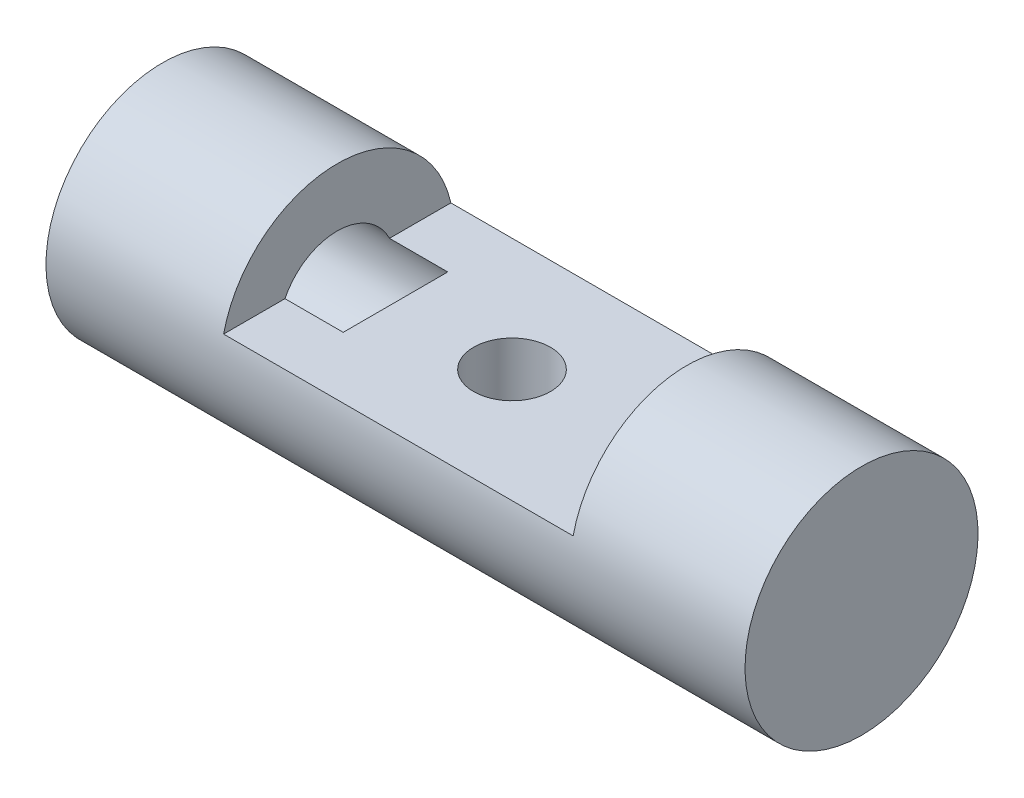
ISO-10303-21;
HEADER;
FILE_DESCRIPTION(('STEP AP214'),'2;1');
FILE_NAME('part.step','',(''),(''),'','','');
FILE_SCHEMA(('AUTOMOTIVE_DESIGN { 1 0 10303 214 1 1 1 1 }'));
ENDSEC;
DATA;
#1=APPLICATION_CONTEXT('core data for automotive mechanical design processes');
#2=APPLICATION_PROTOCOL_DEFINITION('international standard','automotive_design',2000,#1);
#3=PRODUCT_CONTEXT('',#1,'mechanical');
#4=PRODUCT('Part','Part','',(#3));
#5=PRODUCT_RELATED_PRODUCT_CATEGORY('part','',(#4));
#6=PRODUCT_DEFINITION_FORMATION('','',#4);
#7=PRODUCT_DEFINITION_CONTEXT('part definition',#1,'design');
#8=PRODUCT_DEFINITION('design','',#6,#7);
#9=PRODUCT_DEFINITION_SHAPE('','',#8);
#10=(LENGTH_UNIT() NAMED_UNIT(*) SI_UNIT(.MILLI.,.METRE.));
#11=(NAMED_UNIT(*) PLANE_ANGLE_UNIT() SI_UNIT($,.RADIAN.));
#12=(NAMED_UNIT(*) SI_UNIT($,.STERADIAN.) SOLID_ANGLE_UNIT());
#13=UNCERTAINTY_MEASURE_WITH_UNIT(LENGTH_MEASURE(1.E-05),#10,'distance_accuracy_value','');
#14=(GEOMETRIC_REPRESENTATION_CONTEXT(3) GLOBAL_UNCERTAINTY_ASSIGNED_CONTEXT((#13)) GLOBAL_UNIT_ASSIGNED_CONTEXT((#10,
#11,#12)) REPRESENTATION_CONTEXT('',''));
#15=CARTESIAN_POINT('',(0.,0.,0.));
#16=DIRECTION('',(0.,0.,1.));
#17=DIRECTION('',(1.,0.,0.));
#18=AXIS2_PLACEMENT_3D('',#15,#16,#17);
#19=CARTESIAN_POINT('',(-15.,0.,0.));
#20=DIRECTION('',(-1.,0.,0.));
#21=DIRECTION('',(0.,-1.,0.));
#22=AXIS2_PLACEMENT_3D('',#19,#20,#21);
#23=CYLINDRICAL_SURFACE('',#22,5.);
#24=CARTESIAN_POINT('',(1.65,-5.,0.));
#25=CARTESIAN_POINT('',(1.65000024251439,-5.00000012564882,0.090080332398987));
#26=CARTESIAN_POINT('',(1.64259916251505,-4.99754312617873,0.180159574077354));
#27=CARTESIAN_POINT('',(1.61327885047236,-4.98798348171152,0.357667875169256));
#28=CARTESIAN_POINT('',(1.59135782416471,-4.98088026257135,0.445096605656319));
#29=CARTESIAN_POINT('',(1.53382868761171,-4.96280068143201,0.614719075952393));
#30=CARTESIAN_POINT('',(1.49824318298597,-4.95183071876683,0.696921201899967));
#31=CARTESIAN_POINT('',(1.41449642730815,-4.92713947248838,0.854190645874483));
#32=CARTESIAN_POINT('',(1.36633277369657,-4.91341766335966,0.92925659707605));
#33=CARTESIAN_POINT('',(1.25707517692859,-4.88414667976015,1.07267700256014));
#34=CARTESIAN_POINT('',(1.19562998172584,-4.86855436886587,1.140755021368));
#35=CARTESIAN_POINT('',(1.06230048608017,-4.83753907804007,1.26585047260417));
#36=CARTESIAN_POINT('',(0.990413953307284,-4.8221161350793,1.32286553369749));
#37=CARTESIAN_POINT('',(0.835769387620546,-4.79271313173334,1.42578155512387));
#38=CARTESIAN_POINT('',(0.752762762414837,-4.77878574898835,1.47132547146369));
#39=CARTESIAN_POINT('',(0.579734369165923,-4.75460549483771,1.54768950007051));
#40=CARTESIAN_POINT('',(0.489714702647667,-4.74435152777496,1.57851400356115));
#41=CARTESIAN_POINT('',(0.308355170918736,-4.729132826351,1.62353134991423));
#42=CARTESIAN_POINT('',(0.217157836674354,-4.72400412235766,1.6382413417332));
#43=CARTESIAN_POINT('',(0.0334563873059896,-4.7191313464795,1.65222861163856));
#44=CARTESIAN_POINT('',(-0.0590473250677401,-4.71938564975367,1.65151054662634));
#45=CARTESIAN_POINT('',(-0.238347202392313,-4.72510629107569,1.63506410098719));
#46=CARTESIAN_POINT('',(-0.325213735238814,-4.73033928879681,1.62000769651632));
#47=CARTESIAN_POINT('',(-0.495110906166727,-4.74504632523487,1.57640708934977));
#48=CARTESIAN_POINT('',(-0.578141092265254,-4.75452086227438,1.54786130181506));
#49=CARTESIAN_POINT('',(-0.739547439994633,-4.77681173940999,1.47764674240872));
#50=CARTESIAN_POINT('',(-0.817828850225322,-4.78967871947683,1.43577693123636));
#51=CARTESIAN_POINT('',(-0.966468362301519,-4.81728315916032,1.34024242388315));
#52=CARTESIAN_POINT('',(-1.03682420369405,-4.8320211498719,1.28657437554158));
#53=CARTESIAN_POINT('',(-1.17139522741021,-4.86262798242566,1.16572801734404));
#54=CARTESIAN_POINT('',(-1.23511287864314,-4.87851612594016,1.09799945388895));
#55=CARTESIAN_POINT('',(-1.3504141782392,-4.9089733458653,0.952622363558089));
#56=CARTESIAN_POINT('',(-1.40199670875498,-4.92354230068063,0.874972923819718));
#57=CARTESIAN_POINT('',(-1.49195351683702,-4.94990429259939,0.710918878360193));
#58=CARTESIAN_POINT('',(-1.53019689721305,-4.96166947936115,0.624437715003008));
#59=CARTESIAN_POINT('',(-1.5914397196063,-4.98089634514734,0.445788820584338));
#60=CARTESIAN_POINT('',(-1.61444434706412,-4.98835948795834,0.353623035566634));
#61=CARTESIAN_POINT('',(-1.64368078538325,-4.99790001929539,0.170434936942808));
#62=CARTESIAN_POINT('',(-1.65058509363946,-5.00019320840939,0.0795310449403298));
#63=CARTESIAN_POINT('',(-1.64933736730874,-4.99978120399321,-0.102152997074191));
#64=CARTESIAN_POINT('',(-1.64118781713324,-4.99707683523427,-0.19293316503069));
#65=CARTESIAN_POINT('',(-1.61059717381709,-4.98711592890816,-0.369117276094977));
#66=CARTESIAN_POINT('',(-1.58856678998547,-4.97999029806495,-0.454600657078436));
#67=CARTESIAN_POINT('',(-1.53135130848825,-4.9620361021664,-0.620625393385989));
#68=CARTESIAN_POINT('',(-1.4961645401181,-4.95120706683759,-0.701166119538831));
#69=CARTESIAN_POINT('',(-1.41261898044763,-4.92659738190256,-0.857353583850656));
#70=CARTESIAN_POINT('',(-1.36394138523551,-4.91274728599483,-0.932818538636812));
#71=CARTESIAN_POINT('',(-1.25517176520409,-4.88366806339029,-1.07472879779133));
#72=CARTESIAN_POINT('',(-1.19507631632604,-4.86843852373583,-1.14117138619964));
#73=CARTESIAN_POINT('',(-1.06201382730805,-4.8374590984749,-1.26622547851876));
#74=CARTESIAN_POINT('',(-0.988593133076301,-4.82171620160002,-1.32435715949936));
#75=CARTESIAN_POINT('',(-0.832700145106316,-4.79218567046632,-1.42753142742357));
#76=CARTESIAN_POINT('',(-0.750227816840758,-4.77839804366633,-1.47257396443646));
#77=CARTESIAN_POINT('',(-0.578574516041665,-4.75447746870333,-1.54806908435207));
#78=CARTESIAN_POINT('',(-0.489410014022784,-4.74433588191365,-1.57855621066785));
#79=CARTESIAN_POINT('',(-0.306802097920406,-4.72899266246799,-1.62395003915296));
#80=CARTESIAN_POINT('',(-0.213360579787974,-4.72378886275909,-1.63886357641239));
#81=CARTESIAN_POINT('',(-0.0299145750870886,-4.71915352744857,-1.65216049477083));
#82=CARTESIAN_POINT('',(0.0600259363781703,-4.71944442417866,-1.65133872365081));
#83=CARTESIAN_POINT('',(0.238416599590154,-4.72508139490562,-1.63513842564514));
#84=CARTESIAN_POINT('',(0.326866836415119,-4.7304271793221,-1.61976073262755));
#85=CARTESIAN_POINT('',(0.498164137184589,-4.74536693764462,-1.57544291875231));
#86=CARTESIAN_POINT('',(0.581083972157472,-4.75488165289364,-1.5467552709297));
#87=CARTESIAN_POINT('',(0.740997492662577,-4.77705935615133,-1.47683540940045));
#88=CARTESIAN_POINT('',(0.817989874951903,-4.78972303393434,-1.43560044678476));
#89=CARTESIAN_POINT('',(0.967443454366385,-4.81744939348764,-1.33969084183065));
#90=CARTESIAN_POINT('',(1.03956841106977,-4.83259170443489,-1.28451538865981));
#91=CARTESIAN_POINT('',(1.17379258067502,-4.86323043063063,-1.16314331347536));
#92=CARTESIAN_POINT('',(1.23588897512673,-4.87872694403301,-1.09694360376003));
#93=CARTESIAN_POINT('',(1.35066333180925,-4.90903317548773,-0.952387676734103));
#94=CARTESIAN_POINT('',(1.40289502168525,-4.92379458911326,-0.873665758138171));
#95=CARTESIAN_POINT('',(1.49332485789776,-4.95031750248797,-0.70807708205127));
#96=CARTESIAN_POINT('',(1.53152691711137,-4.96207983840249,-0.621212604024478));
#97=CARTESIAN_POINT('',(1.59101301503052,-4.98076953032462,-0.44638654187221));
#98=CARTESIAN_POINT('',(1.61306352248398,-4.98791371763214,-0.35870915508395));
#99=CARTESIAN_POINT('',(1.6425549720432,-4.99752827480817,-0.180687007883427));
#100=CARTESIAN_POINT('',(1.64999975677857,-4.99999987398486,-0.0903429553968474));
#101=CARTESIAN_POINT('',(1.65,-5.,0.));
#102=B_SPLINE_CURVE_WITH_KNOTS('',3,(#24,#25,#26,#27,#28,#29,#30,#31,#32,#33,#34,#35,#36,#37,
#38,#39,#40,#41,#42,#43,#44,#45,#46,#47,#48,#49,#50,#51,#52,#53,#54,#55,#56,#57,#58,#59,#60,#61,
#62,#63,#64,#65,#66,#67,#68,#69,#70,#71,#72,#73,#74,#75,#76,#77,#78,#79,#80,#81,#82,#83,#84,#85,
#86,#87,#88,#89,#90,#91,#92,#93,#94,#95,#96,#97,#98,#99,#100,#101),.UNSPECIFIED.,.T.,.F.,(4,2,2,
2,2,2,2,2,2,2,2,2,2,2,2,2,2,2,2,2,2,2,2,2,2,2,2,2,2,2,2,2,2,2,2,2,2,2,4),(0.,0.2699086041325,
0.539850567737247,0.809347867689093,1.07889668217443,1.35671215765951,1.63458711701568,
1.92026489148117,2.20585738673402,2.48198869358466,2.75803665240173,3.02175295330503,
3.28550024538372,3.55343249441286,3.82144096800204,4.10314526837294,4.38487550826386,
4.66929734218008,4.95362234329174,5.22584041060146,5.49801355645392,5.76248915124947,
6.02699834271654,6.29838751507404,6.56985820217367,6.85340472718153,7.13695233381085,
7.41982362841785,7.7025707214407,7.97107468624608,8.23956327014094,8.50315503612409,
8.7668045923309,9.04176838412561,9.31680931840236,9.60227659952696,9.88766420298744,
10.1584309528124,10.4291264568694),.UNSPECIFIED.);
#103=CARTESIAN_POINT('',(1.65,-5.,0.));
#104=VERTEX_POINT('',#103);
#105=EDGE_CURVE('E11',#104,#104,#102,.T.);
#106=ORIENTED_EDGE('',*,*,#105,.F.);
#107=EDGE_LOOP('',(#106));
#108=FACE_BOUND('',#107,.T.);
#109=CARTESIAN_POINT('',(-15.,0.,0.));
#110=DIRECTION('',(-1.,0.,0.));
#111=DIRECTION('',(0.,-1.,0.));
#112=AXIS2_PLACEMENT_3D('',#109,#110,#111);
#113=CIRCLE('',#112,5.);
#114=CARTESIAN_POINT('',(-15.,-5.,0.));
#115=VERTEX_POINT('',#114);
#116=EDGE_CURVE('E28',#115,#115,#113,.T.);
#117=ORIENTED_EDGE('',*,*,#116,.F.);
#118=EDGE_LOOP('',(#117));
#119=FACE_BOUND('',#118,.T.);
#120=CARTESIAN_POINT('',(15.,0.,0.));
#121=DIRECTION('',(-1.,0.,0.));
#122=DIRECTION('',(0.,-1.,0.));
#123=AXIS2_PLACEMENT_3D('',#120,#121,#122);
#124=CIRCLE('',#123,5.);
#125=CARTESIAN_POINT('',(15.,-4.99999999999999,0.));
#126=VERTEX_POINT('',#125);
#127=EDGE_CURVE('E100',#126,#126,#124,.T.);
#128=ORIENTED_EDGE('',*,*,#127,.T.);
#129=EDGE_LOOP('',(#128));
#130=FACE_BOUND('',#129,.T.);
#131=DIRECTION('',(-1.,0.,0.));
#132=VECTOR('',#131,1.);
#133=CARTESIAN_POINT('',(-15.,1.10378117628698,4.87664506755152));
#134=LINE('',#133,#132);
#135=CARTESIAN_POINT('',(-7.5,1.10378117628698,4.87664506755152));
#136=VERTEX_POINT('',#135);
#137=CARTESIAN_POINT('',(7.5,1.10378117628698,4.87664506755152));
#138=VERTEX_POINT('',#137);
#139=EDGE_CURVE('E35',#136,#138,#134,.F.);
#140=ORIENTED_EDGE('',*,*,#139,.F.);
#141=CARTESIAN_POINT('',(-7.5,0.,0.));
#142=DIRECTION('',(1.,0.,0.));
#143=DIRECTION('',(0.,1.,0.));
#144=AXIS2_PLACEMENT_3D('',#141,#142,#143);
#145=CIRCLE('',#144,5.);
#146=CARTESIAN_POINT('',(-7.5,1.10378117628698,-4.87664506755152));
#147=VERTEX_POINT('',#146);
#148=EDGE_CURVE('E90',#147,#136,#145,.T.);
#149=ORIENTED_EDGE('',*,*,#148,.F.);
#150=DIRECTION('',(-1.,0.,0.));
#151=VECTOR('',#150,1.);
#152=CARTESIAN_POINT('',(-15.,1.10378117628698,-4.87664506755152));
#153=LINE('',#152,#151);
#154=CARTESIAN_POINT('',(7.5,1.10378117628698,-4.87664506755152));
#155=VERTEX_POINT('',#154);
#156=EDGE_CURVE('E76',#147,#155,#153,.F.);
#157=ORIENTED_EDGE('',*,*,#156,.T.);
#158=CARTESIAN_POINT('',(7.5,0.,0.));
#159=DIRECTION('',(-1.,0.,0.));
#160=DIRECTION('',(0.,-1.,0.));
#161=AXIS2_PLACEMENT_3D('',#158,#159,#160);
#162=CIRCLE('',#161,5.);
#163=EDGE_CURVE('E92',#138,#155,#162,.T.);
#164=ORIENTED_EDGE('',*,*,#163,.F.);
#165=EDGE_LOOP('',(#140,#149,#157,#164));
#166=FACE_BOUND('',#165,.T.);
#167=ADVANCED_FACE('F17',(#108,#119,#130,#166),#23,.T.);
#168=CARTESIAN_POINT('',(-5.,0.,0.));
#169=DIRECTION('',(-1.,0.,0.));
#170=DIRECTION('',(0.,-1.,0.));
#171=AXIS2_PLACEMENT_3D('',#168,#169,#170);
#172=CYLINDRICAL_SURFACE('',#171,2.5);
#173=CARTESIAN_POINT('',(-15.,0.,0.));
#174=DIRECTION('',(-1.,0.,0.));
#175=DIRECTION('',(0.,-1.,0.));
#176=AXIS2_PLACEMENT_3D('',#173,#174,#175);
#177=CIRCLE('',#176,2.5);
#178=CARTESIAN_POINT('',(-15.,-2.5,0.));
#179=VERTEX_POINT('',#178);
#180=EDGE_CURVE('E98',#179,#179,#177,.T.);
#181=ORIENTED_EDGE('',*,*,#180,.T.);
#182=EDGE_LOOP('',(#181));
#183=FACE_BOUND('',#182,.T.);
#184=DIRECTION('',(-1.,0.,0.));
#185=VECTOR('',#184,1.);
#186=CARTESIAN_POINT('',(-5.,1.10378117628698,-2.24313778330144));
#187=LINE('',#186,#185);
#188=CARTESIAN_POINT('',(-7.5,1.10378117628698,-2.24313778330144));
#189=VERTEX_POINT('',#188);
#190=CARTESIAN_POINT('',(-5.,1.10378117628698,-2.24313778330144));
#191=VERTEX_POINT('',#190);
#192=EDGE_CURVE('E42',#189,#191,#187,.F.);
#193=ORIENTED_EDGE('',*,*,#192,.F.);
#194=CARTESIAN_POINT('',(-7.5,0.,0.));
#195=DIRECTION('',(1.,0.,0.));
#196=DIRECTION('',(0.,1.,0.));
#197=AXIS2_PLACEMENT_3D('',#194,#195,#196);
#198=CIRCLE('',#197,2.5);
#199=CARTESIAN_POINT('',(-7.5,1.10378117628698,2.24313778330144));
#200=VERTEX_POINT('',#199);
#201=EDGE_CURVE('E62',#189,#200,#198,.T.);
#202=ORIENTED_EDGE('',*,*,#201,.T.);
#203=DIRECTION('',(-1.,0.,0.));
#204=VECTOR('',#203,1.);
#205=CARTESIAN_POINT('',(-5.,1.10378117628698,2.24313778330144));
#206=LINE('',#205,#204);
#207=CARTESIAN_POINT('',(-5.,1.10378117628698,2.24313778330144));
#208=VERTEX_POINT('',#207);
#209=EDGE_CURVE('E71',#200,#208,#206,.F.);
#210=ORIENTED_EDGE('',*,*,#209,.T.);
#211=CARTESIAN_POINT('',(-5.,0.,0.));
#212=DIRECTION('',(-1.,0.,0.));
#213=DIRECTION('',(0.,-1.,0.));
#214=AXIS2_PLACEMENT_3D('',#211,#212,#213);
#215=CIRCLE('',#214,2.5);
#216=EDGE_CURVE('E81',#191,#208,#215,.T.);
#217=ORIENTED_EDGE('',*,*,#216,.F.);
#218=EDGE_LOOP('',(#193,#202,#210,#217));
#219=FACE_BOUND('',#218,.T.);
#220=ADVANCED_FACE('F79',(#183,#219),#172,.F.);
#221=CARTESIAN_POINT('',(-5.,0.,0.));
#222=DIRECTION('',(-1.,0.,0.));
#223=DIRECTION('',(0.,-1.,0.));
#224=AXIS2_PLACEMENT_3D('',#221,#222,#223);
#225=PLANE('',#224);
#226=ORIENTED_EDGE('',*,*,#216,.T.);
#227=DIRECTION('',(0.,0.,1.));
#228=VECTOR('',#227,1.);
#229=CARTESIAN_POINT('',(-5.,1.10378117628698,5.001));
#230=LINE('',#229,#228);
#231=EDGE_CURVE('E72',#191,#208,#230,.T.);
#232=ORIENTED_EDGE('',*,*,#231,.F.);
#233=EDGE_LOOP('',(#226,#232));
#234=FACE_BOUND('',#233,.T.);
#235=ADVANCED_FACE('F131',(#234),#225,.T.);
#236=CARTESIAN_POINT('',(-15.,-5.,0.));
#237=DIRECTION('',(1.,0.,0.));
#238=DIRECTION('',(0.,1.,0.));
#239=AXIS2_PLACEMENT_3D('',#236,#237,#238);
#240=PLANE('',#239);
#241=ORIENTED_EDGE('',*,*,#180,.F.);
#242=EDGE_LOOP('',(#241));
#243=FACE_BOUND('',#242,.T.);
#244=ORIENTED_EDGE('',*,*,#116,.T.);
#245=EDGE_LOOP('',(#244));
#246=FACE_BOUND('',#245,.T.);
#247=ADVANCED_FACE('F107',(#243,#246),#240,.F.);
#248=CARTESIAN_POINT('',(15.,0.,0.));
#249=DIRECTION('',(-1.,0.,0.));
#250=DIRECTION('',(0.,-1.,0.));
#251=AXIS2_PLACEMENT_3D('',#248,#249,#250);
#252=PLANE('',#251);
#253=ORIENTED_EDGE('',*,*,#127,.F.);
#254=EDGE_LOOP('',(#253));
#255=FACE_BOUND('',#254,.T.);
#256=ADVANCED_FACE('F138',(#255),#252,.F.);
#257=CARTESIAN_POINT('',(-7.5,8.89621882371303,5.001));
#258=DIRECTION('',(1.,0.,0.));
#259=DIRECTION('',(0.,1.,0.));
#260=AXIS2_PLACEMENT_3D('',#257,#258,#259);
#261=PLANE('',#260);
#262=ORIENTED_EDGE('',*,*,#148,.T.);
#263=DIRECTION('',(0.,0.,-1.));
#264=VECTOR('',#263,1.);
#265=CARTESIAN_POINT('',(-7.5,1.10378117628698,5.001));
#266=LINE('',#265,#264);
#267=EDGE_CURVE('E67',#136,#200,#266,.T.);
#268=ORIENTED_EDGE('',*,*,#267,.T.);
#269=ORIENTED_EDGE('',*,*,#201,.F.);
#270=DIRECTION('',(0.,0.,1.));
#271=VECTOR('',#270,1.);
#272=CARTESIAN_POINT('',(-7.5,1.10378117628698,-5.001));
#273=LINE('',#272,#271);
#274=EDGE_CURVE('E65',#147,#189,#273,.T.);
#275=ORIENTED_EDGE('',*,*,#274,.F.);
#276=EDGE_LOOP('',(#262,#268,#269,#275));
#277=FACE_BOUND('',#276,.T.);
#278=ADVANCED_FACE('F64',(#277),#261,.T.);
#279=CARTESIAN_POINT('',(-7.5,1.10378117628698,5.001));
#280=DIRECTION('',(0.,1.,0.));
#281=DIRECTION('',(0.,0.,1.));
#282=AXIS2_PLACEMENT_3D('',#279,#280,#281);
#283=PLANE('',#282);
#284=CARTESIAN_POINT('',(0.,1.10378117628698,0.));
#285=DIRECTION('',(0.,1.,0.));
#286=DIRECTION('',(0.,0.,1.));
#287=AXIS2_PLACEMENT_3D('',#284,#285,#286);
#288=CIRCLE('',#287,1.65);
#289=CARTESIAN_POINT('',(0.,1.10378117628698,1.65));
#290=VERTEX_POINT('',#289);
#291=EDGE_CURVE('E82',#290,#290,#288,.T.);
#292=ORIENTED_EDGE('',*,*,#291,.F.);
#293=EDGE_LOOP('',(#292));
#294=FACE_BOUND('',#293,.T.);
#295=ORIENTED_EDGE('',*,*,#139,.T.);
#296=DIRECTION('',(0.,0.,-1.));
#297=VECTOR('',#296,1.);
#298=CARTESIAN_POINT('',(7.5,1.10378117628698,5.001));
#299=LINE('',#298,#297);
#300=EDGE_CURVE('E95',#138,#155,#299,.T.);
#301=ORIENTED_EDGE('',*,*,#300,.T.);
#302=ORIENTED_EDGE('',*,*,#156,.F.);
#303=ORIENTED_EDGE('',*,*,#274,.T.);
#304=ORIENTED_EDGE('',*,*,#192,.T.);
#305=ORIENTED_EDGE('',*,*,#231,.T.);
#306=ORIENTED_EDGE('',*,*,#209,.F.);
#307=ORIENTED_EDGE('',*,*,#267,.F.);
#308=EDGE_LOOP('',(#295,#301,#302,#303,#304,#305,#306,#307));
#309=FACE_BOUND('',#308,.T.);
#310=ADVANCED_FACE('F74',(#294,#309),#283,.T.);
#311=CARTESIAN_POINT('',(7.5,8.89621882371303,5.001));
#312=DIRECTION('',(-1.,0.,0.));
#313=DIRECTION('',(0.,-1.,0.));
#314=AXIS2_PLACEMENT_3D('',#311,#312,#313);
#315=PLANE('',#314);
#316=ORIENTED_EDGE('',*,*,#163,.T.);
#317=ORIENTED_EDGE('',*,*,#300,.F.);
#318=EDGE_LOOP('',(#316,#317));
#319=FACE_BOUND('',#318,.T.);
#320=ADVANCED_FACE('F116',(#319),#315,.T.);
#321=CARTESIAN_POINT('',(0.,1.10378117628698,0.));
#322=DIRECTION('',(0.,1.,0.));
#323=DIRECTION('',(0.,0.,1.));
#324=AXIS2_PLACEMENT_3D('',#321,#322,#323);
#325=CYLINDRICAL_SURFACE('',#324,1.65);
#326=ORIENTED_EDGE('',*,*,#105,.T.);
#327=EDGE_LOOP('',(#326));
#328=FACE_BOUND('',#327,.T.);
#329=ORIENTED_EDGE('',*,*,#291,.T.);
#330=EDGE_LOOP('',(#329));
#331=FACE_BOUND('',#330,.T.);
#332=ADVANCED_FACE('F118',(#328,#331),#325,.F.);
#333=CLOSED_SHELL('',(#167,#220,#235,#247,#256,#278,#310,#320,#332));
#334=MANIFOLD_SOLID_BREP('B1',#333);
#335=ADVANCED_BREP_SHAPE_REPRESENTATION('',(#18,#334),#14);
#336=SHAPE_DEFINITION_REPRESENTATION(#9,#335);
ENDSEC;
END-ISO-10303-21;
